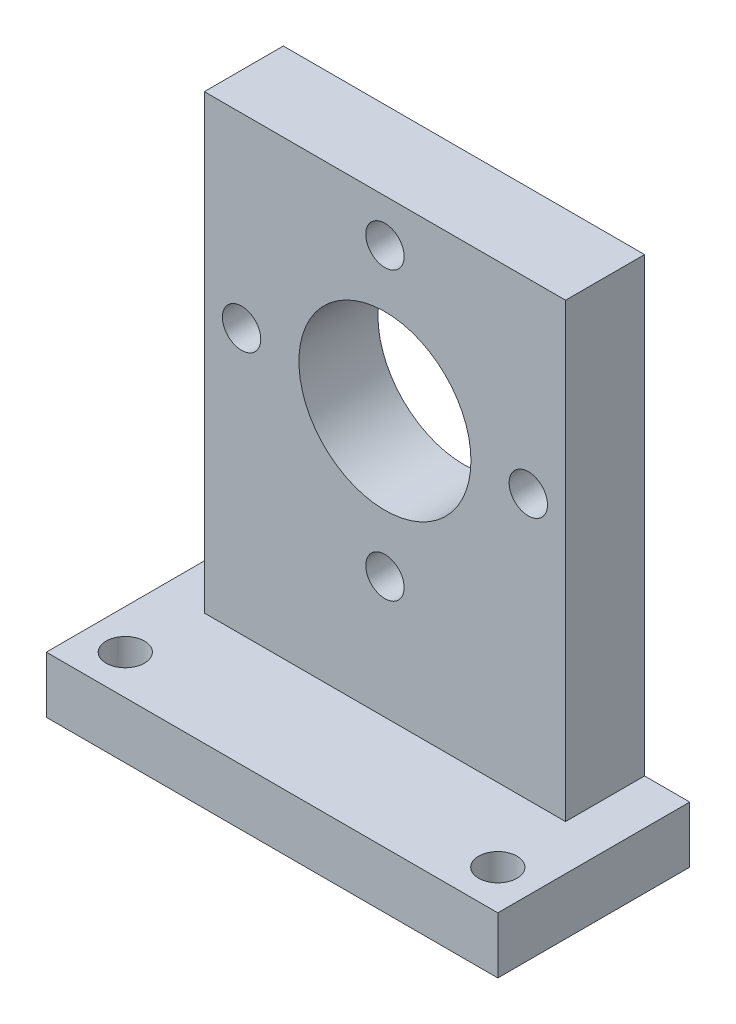
ISO-10303-21;
HEADER;
FILE_DESCRIPTION(('STEP AP214'),'2;1');
FILE_NAME('part.step','',(''),(''),'','','');
FILE_SCHEMA(('AUTOMOTIVE_DESIGN { 1 0 10303 214 1 1 1 1 }'));
ENDSEC;
DATA;
#1=APPLICATION_CONTEXT('core data for automotive mechanical design processes');
#2=APPLICATION_PROTOCOL_DEFINITION('international standard','automotive_design',2000,#1);
#3=PRODUCT_CONTEXT('',#1,'mechanical');
#4=PRODUCT('Part','Part','',(#3));
#5=PRODUCT_RELATED_PRODUCT_CATEGORY('part','',(#4));
#6=PRODUCT_DEFINITION_FORMATION('','',#4);
#7=PRODUCT_DEFINITION_CONTEXT('part definition',#1,'design');
#8=PRODUCT_DEFINITION('design','',#6,#7);
#9=PRODUCT_DEFINITION_SHAPE('','',#8);
#10=(LENGTH_UNIT() NAMED_UNIT(*) SI_UNIT(.MILLI.,.METRE.));
#11=(NAMED_UNIT(*) PLANE_ANGLE_UNIT() SI_UNIT($,.RADIAN.));
#12=(NAMED_UNIT(*) SI_UNIT($,.STERADIAN.) SOLID_ANGLE_UNIT());
#13=UNCERTAINTY_MEASURE_WITH_UNIT(LENGTH_MEASURE(1.E-05),#10,'distance_accuracy_value','');
#14=(GEOMETRIC_REPRESENTATION_CONTEXT(3) GLOBAL_UNCERTAINTY_ASSIGNED_CONTEXT((#13)) GLOBAL_UNIT_ASSIGNED_CONTEXT((#10,
#11,#12)) REPRESENTATION_CONTEXT('',''));
#15=CARTESIAN_POINT('',(0.,0.,0.));
#16=DIRECTION('',(0.,0.,1.));
#17=DIRECTION('',(1.,0.,0.));
#18=AXIS2_PLACEMENT_3D('',#15,#16,#17);
#19=CARTESIAN_POINT('',(-20.,5.,13.5));
#20=DIRECTION('',(0.,0.,-1.));
#21=DIRECTION('',(-1.,0.,0.));
#22=AXIS2_PLACEMENT_3D('',#19,#20,#21);
#23=PLANE('',#22);
#24=DIRECTION('',(1.,0.,0.));
#25=VECTOR('',#24,1.);
#26=CARTESIAN_POINT('',(-20.,0.,13.5));
#27=LINE('',#26,#25);
#28=CARTESIAN_POINT('',(-20.,0.,13.5));
#29=VERTEX_POINT('',#28);
#30=CARTESIAN_POINT('',(20.,0.,13.5));
#31=VERTEX_POINT('',#30);
#32=EDGE_CURVE('E113',#29,#31,#27,.T.);
#33=ORIENTED_EDGE('',*,*,#32,.T.);
#34=DIRECTION('',(0.,-1.,0.));
#35=VECTOR('',#34,1.);
#36=CARTESIAN_POINT('',(20.,5.,13.5));
#37=LINE('',#36,#35);
#38=CARTESIAN_POINT('',(20.,5.,13.5));
#39=VERTEX_POINT('',#38);
#40=EDGE_CURVE('E12',#39,#31,#37,.T.);
#41=ORIENTED_EDGE('',*,*,#40,.F.);
#42=DIRECTION('',(1.,0.,0.));
#43=VECTOR('',#42,1.);
#44=CARTESIAN_POINT('',(-20.,5.,13.5));
#45=LINE('',#44,#43);
#46=CARTESIAN_POINT('',(-20.,5.,13.5));
#47=VERTEX_POINT('',#46);
#48=EDGE_CURVE('E107',#47,#39,#45,.T.);
#49=ORIENTED_EDGE('',*,*,#48,.F.);
#50=DIRECTION('',(0.,-1.,0.));
#51=VECTOR('',#50,1.);
#52=CARTESIAN_POINT('',(-20.,5.,13.5));
#53=LINE('',#52,#51);
#54=EDGE_CURVE('E68',#47,#29,#53,.T.);
#55=ORIENTED_EDGE('',*,*,#54,.T.);
#56=EDGE_LOOP('',(#33,#41,#49,#55));
#57=FACE_BOUND('',#56,.T.);
#58=ADVANCED_FACE('F61',(#57),#23,.F.);
#59=CARTESIAN_POINT('',(20.,5.,-13.5));
#60=DIRECTION('',(1.,0.,0.));
#61=DIRECTION('',(0.,0.,-1.));
#62=AXIS2_PLACEMENT_3D('',#59,#60,#61);
#63=PLANE('',#62);
#64=DIRECTION('',(0.,1.,0.));
#65=VECTOR('',#64,1.);
#66=CARTESIAN_POINT('',(20.,-0.00100000000000013,-3.5));
#67=LINE('',#66,#65);
#68=CARTESIAN_POINT('',(20.,0.,-3.5));
#69=VERTEX_POINT('',#68);
#70=CARTESIAN_POINT('',(20.,5.,-3.5));
#71=VERTEX_POINT('',#70);
#72=EDGE_CURVE('E197',#69,#71,#67,.T.);
#73=ORIENTED_EDGE('',*,*,#72,.T.);
#74=DIRECTION('',(0.,0.,1.));
#75=VECTOR('',#74,1.);
#76=CARTESIAN_POINT('',(20.,5.,-13.5));
#77=LINE('',#76,#75);
#78=EDGE_CURVE('E123',#71,#39,#77,.T.);
#79=ORIENTED_EDGE('',*,*,#78,.T.);
#80=ORIENTED_EDGE('',*,*,#40,.T.);
#81=DIRECTION('',(0.,0.,1.));
#82=VECTOR('',#81,1.);
#83=CARTESIAN_POINT('',(20.,0.,-13.5));
#84=LINE('',#83,#82);
#85=EDGE_CURVE('E108',#69,#31,#84,.T.);
#86=ORIENTED_EDGE('',*,*,#85,.F.);
#87=EDGE_LOOP('',(#73,#79,#80,#86));
#88=FACE_BOUND('',#87,.T.);
#89=ADVANCED_FACE('F233',(#88),#63,.T.);
#90=CARTESIAN_POINT('',(-20.,5.,-13.5));
#91=DIRECTION('',(1.,0.,0.));
#92=DIRECTION('',(0.,0.,-1.));
#93=AXIS2_PLACEMENT_3D('',#90,#91,#92);
#94=PLANE('',#93);
#95=DIRECTION('',(0.,0.,1.));
#96=VECTOR('',#95,1.);
#97=CARTESIAN_POINT('',(-20.,5.,-13.5));
#98=LINE('',#97,#96);
#99=CARTESIAN_POINT('',(-20.,5.,-3.5));
#100=VERTEX_POINT('',#99);
#101=EDGE_CURVE('E83',#100,#47,#98,.T.);
#102=ORIENTED_EDGE('',*,*,#101,.F.);
#103=DIRECTION('',(0.,1.,0.));
#104=VECTOR('',#103,1.);
#105=CARTESIAN_POINT('',(-20.,-0.00100000000000013,-3.5));
#106=LINE('',#105,#104);
#107=CARTESIAN_POINT('',(-20.,0.,-3.5));
#108=VERTEX_POINT('',#107);
#109=EDGE_CURVE('E103',#108,#100,#106,.T.);
#110=ORIENTED_EDGE('',*,*,#109,.F.);
#111=DIRECTION('',(0.,0.,1.));
#112=VECTOR('',#111,1.);
#113=CARTESIAN_POINT('',(-20.,0.,-13.5));
#114=LINE('',#113,#112);
#115=EDGE_CURVE('E97',#108,#29,#114,.T.);
#116=ORIENTED_EDGE('',*,*,#115,.T.);
#117=ORIENTED_EDGE('',*,*,#54,.F.);
#118=EDGE_LOOP('',(#102,#110,#116,#117));
#119=FACE_BOUND('',#118,.T.);
#120=ADVANCED_FACE('F99',(#119),#94,.F.);
#121=CARTESIAN_POINT('',(0.,5.,0.));
#122=DIRECTION('',(0.,-1.,0.));
#123=DIRECTION('',(0.,0.,-1.));
#124=AXIS2_PLACEMENT_3D('',#121,#122,#123);
#125=PLANE('',#124);
#126=CARTESIAN_POINT('',(16.5,5.,10.));
#127=DIRECTION('',(0.,1.,0.));
#128=DIRECTION('',(0.,0.,-1.));
#129=AXIS2_PLACEMENT_3D('',#126,#127,#128);
#130=CIRCLE('',#129,1.7);
#131=CARTESIAN_POINT('',(16.5,5.,8.3));
#132=VERTEX_POINT('',#131);
#133=EDGE_CURVE('E184',#132,#132,#130,.T.);
#134=ORIENTED_EDGE('',*,*,#133,.F.);
#135=EDGE_LOOP('',(#134));
#136=FACE_BOUND('',#135,.T.);
#137=CARTESIAN_POINT('',(-16.5,5.,10.));
#138=DIRECTION('',(0.,1.,0.));
#139=DIRECTION('',(0.,0.,1.));
#140=AXIS2_PLACEMENT_3D('',#137,#138,#139);
#141=CIRCLE('',#140,1.7);
#142=CARTESIAN_POINT('',(-16.5,5.,11.7));
#143=VERTEX_POINT('',#142);
#144=EDGE_CURVE('E191',#143,#143,#141,.T.);
#145=ORIENTED_EDGE('',*,*,#144,.F.);
#146=EDGE_LOOP('',(#145));
#147=FACE_BOUND('',#146,.T.);
#148=ORIENTED_EDGE('',*,*,#78,.F.);
#149=DIRECTION('',(1.,0.,0.));
#150=VECTOR('',#149,1.);
#151=CARTESIAN_POINT('',(-20.,5.,-3.5));
#152=LINE('',#151,#150);
#153=CARTESIAN_POINT('',(16.,5.,-3.5));
#154=VERTEX_POINT('',#153);
#155=EDGE_CURVE('E204',#154,#71,#152,.T.);
#156=ORIENTED_EDGE('',*,*,#155,.F.);
#157=DIRECTION('',(0.,0.,1.));
#158=VECTOR('',#157,1.);
#159=CARTESIAN_POINT('',(16.,5.,0.));
#160=LINE('',#159,#158);
#161=CARTESIAN_POINT('',(16.,5.00000000000001,3.5));
#162=VERTEX_POINT('',#161);
#163=EDGE_CURVE('E127',#154,#162,#160,.T.);
#164=ORIENTED_EDGE('',*,*,#163,.T.);
#165=DIRECTION('',(1.,0.,0.));
#166=VECTOR('',#165,1.);
#167=CARTESIAN_POINT('',(0.,5.,3.5));
#168=LINE('',#167,#166);
#169=CARTESIAN_POINT('',(-16.,5.,3.5));
#170=VERTEX_POINT('',#169);
#171=EDGE_CURVE('E75',#170,#162,#168,.T.);
#172=ORIENTED_EDGE('',*,*,#171,.F.);
#173=DIRECTION('',(0.,0.,1.));
#174=VECTOR('',#173,1.);
#175=CARTESIAN_POINT('',(-16.,5.,0.));
#176=LINE('',#175,#174);
#177=CARTESIAN_POINT('',(-16.,5.,-3.5));
#178=VERTEX_POINT('',#177);
#179=EDGE_CURVE('E119',#178,#170,#176,.T.);
#180=ORIENTED_EDGE('',*,*,#179,.F.);
#181=EDGE_CURVE('E199',#100,#178,#152,.T.);
#182=ORIENTED_EDGE('',*,*,#181,.F.);
#183=ORIENTED_EDGE('',*,*,#101,.T.);
#184=ORIENTED_EDGE('',*,*,#48,.T.);
#185=EDGE_LOOP('',(#148,#156,#164,#172,#180,#182,#183,#184));
#186=FACE_BOUND('',#185,.T.);
#187=ADVANCED_FACE('F234',(#136,#147,#186),#125,.F.);
#188=CARTESIAN_POINT('',(0.,0.,0.));
#189=DIRECTION('',(0.,-1.,0.));
#190=DIRECTION('',(0.,0.,-1.));
#191=AXIS2_PLACEMENT_3D('',#188,#189,#190);
#192=PLANE('',#191);
#193=DIRECTION('',(1.,0.,0.));
#194=VECTOR('',#193,1.);
#195=CARTESIAN_POINT('',(-20.,0.,-3.5));
#196=LINE('',#195,#194);
#197=EDGE_CURVE('E188',#108,#69,#196,.T.);
#198=ORIENTED_EDGE('',*,*,#197,.T.);
#199=ORIENTED_EDGE('',*,*,#85,.T.);
#200=ORIENTED_EDGE('',*,*,#32,.F.);
#201=ORIENTED_EDGE('',*,*,#115,.F.);
#202=EDGE_LOOP('',(#198,#199,#200,#201));
#203=FACE_BOUND('',#202,.T.);
#204=CARTESIAN_POINT('',(16.5,0.,10.));
#205=DIRECTION('',(0.,-1.,0.));
#206=DIRECTION('',(0.,0.,-1.));
#207=AXIS2_PLACEMENT_3D('',#204,#205,#206);
#208=CIRCLE('',#207,1.7);
#209=CARTESIAN_POINT('',(16.5,0.,8.3));
#210=VERTEX_POINT('',#209);
#211=EDGE_CURVE('E187',#210,#210,#208,.F.);
#212=ORIENTED_EDGE('',*,*,#211,.T.);
#213=EDGE_LOOP('',(#212));
#214=FACE_BOUND('',#213,.T.);
#215=CARTESIAN_POINT('',(-16.5,0.,10.));
#216=DIRECTION('',(0.,-1.,0.));
#217=DIRECTION('',(0.,0.,-1.));
#218=AXIS2_PLACEMENT_3D('',#215,#216,#217);
#219=CIRCLE('',#218,1.7);
#220=CARTESIAN_POINT('',(-16.5,0.,8.30000000000001));
#221=VERTEX_POINT('',#220);
#222=EDGE_CURVE('E164',#221,#221,#219,.F.);
#223=ORIENTED_EDGE('',*,*,#222,.T.);
#224=EDGE_LOOP('',(#223));
#225=FACE_BOUND('',#224,.T.);
#226=ADVANCED_FACE('F114',(#203,#214,#225),#192,.T.);
#227=CARTESIAN_POINT('',(0.,45.,-3.5));
#228=DIRECTION('',(0.,0.,-1.));
#229=DIRECTION('',(-1.,0.,0.));
#230=AXIS2_PLACEMENT_3D('',#227,#228,#229);
#231=PLANE('',#230);
#232=CARTESIAN_POINT('',(12.7000000000002,2.5,-3.5));
#233=DIRECTION('',(0.,0.,-1.));
#234=DIRECTION('',(-1.,0.,0.));
#235=AXIS2_PLACEMENT_3D('',#232,#233,#234);
#236=CIRCLE('',#235,1.7);
#237=CARTESIAN_POINT('',(11.0000000000002,2.5,-3.5));
#238=VERTEX_POINT('',#237);
#239=EDGE_CURVE('E211',#238,#238,#236,.T.);
#240=ORIENTED_EDGE('',*,*,#239,.F.);
#241=EDGE_LOOP('',(#240));
#242=FACE_BOUND('',#241,.T.);
#243=CARTESIAN_POINT('',(-12.7000000000002,2.5,-3.5));
#244=DIRECTION('',(0.,0.,-1.));
#245=DIRECTION('',(1.,0.,0.));
#246=AXIS2_PLACEMENT_3D('',#243,#244,#245);
#247=CIRCLE('',#246,1.7);
#248=CARTESIAN_POINT('',(-11.0000000000002,2.5,-3.5));
#249=VERTEX_POINT('',#248);
#250=EDGE_CURVE('E208',#249,#249,#247,.T.);
#251=ORIENTED_EDGE('',*,*,#250,.F.);
#252=EDGE_LOOP('',(#251));
#253=FACE_BOUND('',#252,.T.);
#254=CARTESIAN_POINT('',(0.,41.2,-3.5));
#255=DIRECTION('',(0.,0.,-1.));
#256=DIRECTION('',(-1.,0.,0.));
#257=AXIS2_PLACEMENT_3D('',#254,#255,#256);
#258=CIRCLE('',#257,1.7);
#259=CARTESIAN_POINT('',(-1.7,41.2,-3.5));
#260=VERTEX_POINT('',#259);
#261=EDGE_CURVE('E179',#260,#260,#258,.F.);
#262=ORIENTED_EDGE('',*,*,#261,.T.);
#263=EDGE_LOOP('',(#262));
#264=FACE_BOUND('',#263,.T.);
#265=CARTESIAN_POINT('',(12.7000000000002,28.5000000000001,-3.5));
#266=DIRECTION('',(0.,0.,-1.));
#267=DIRECTION('',(-1.,0.,0.));
#268=AXIS2_PLACEMENT_3D('',#265,#266,#267);
#269=CIRCLE('',#268,1.7);
#270=CARTESIAN_POINT('',(11.0000000000002,28.5000000000001,-3.5));
#271=VERTEX_POINT('',#270);
#272=EDGE_CURVE('E176',#271,#271,#269,.F.);
#273=ORIENTED_EDGE('',*,*,#272,.T.);
#274=EDGE_LOOP('',(#273));
#275=FACE_BOUND('',#274,.T.);
#276=CARTESIAN_POINT('',(2.66516243803523E-13,15.8,-3.5));
#277=DIRECTION('',(0.,0.,-1.));
#278=DIRECTION('',(-1.,0.,0.));
#279=AXIS2_PLACEMENT_3D('',#276,#277,#278);
#280=CIRCLE('',#279,1.7);
#281=CARTESIAN_POINT('',(-1.69999999999973,15.8,-3.5));
#282=VERTEX_POINT('',#281);
#283=EDGE_CURVE('E170',#282,#282,#280,.F.);
#284=ORIENTED_EDGE('',*,*,#283,.T.);
#285=EDGE_LOOP('',(#284));
#286=FACE_BOUND('',#285,.T.);
#287=CARTESIAN_POINT('',(-12.6999999999998,28.5,-3.5));
#288=DIRECTION('',(0.,0.,-1.));
#289=DIRECTION('',(-1.,0.,0.));
#290=AXIS2_PLACEMENT_3D('',#287,#288,#289);
#291=CIRCLE('',#290,1.7);
#292=CARTESIAN_POINT('',(-14.3999999999998,28.5,-3.5));
#293=VERTEX_POINT('',#292);
#294=EDGE_CURVE('E163',#293,#293,#291,.F.);
#295=ORIENTED_EDGE('',*,*,#294,.T.);
#296=EDGE_LOOP('',(#295));
#297=FACE_BOUND('',#296,.T.);
#298=CARTESIAN_POINT('',(0.,28.5,-3.5));
#299=DIRECTION('',(0.,0.,-1.));
#300=DIRECTION('',(-1.,0.,0.));
#301=AXIS2_PLACEMENT_3D('',#298,#299,#300);
#302=CIRCLE('',#301,7.62);
#303=CARTESIAN_POINT('',(-7.62,28.5,-3.5));
#304=VERTEX_POINT('',#303);
#305=EDGE_CURVE('E154',#304,#304,#302,.F.);
#306=ORIENTED_EDGE('',*,*,#305,.T.);
#307=EDGE_LOOP('',(#306));
#308=FACE_BOUND('',#307,.T.);
#309=DIRECTION('',(0.,-1.,0.));
#310=VECTOR('',#309,1.);
#311=CARTESIAN_POINT('',(16.,45.,-3.5));
#312=LINE('',#311,#310);
#313=CARTESIAN_POINT('',(16.,45.,-3.5));
#314=VERTEX_POINT('',#313);
#315=EDGE_CURVE('E129',#314,#154,#312,.T.);
#316=ORIENTED_EDGE('',*,*,#315,.T.);
#317=ORIENTED_EDGE('',*,*,#155,.T.);
#318=ORIENTED_EDGE('',*,*,#72,.F.);
#319=ORIENTED_EDGE('',*,*,#197,.F.);
#320=ORIENTED_EDGE('',*,*,#109,.T.);
#321=ORIENTED_EDGE('',*,*,#181,.T.);
#322=DIRECTION('',(0.,-1.,0.));
#323=VECTOR('',#322,1.);
#324=CARTESIAN_POINT('',(-16.,45.,-3.5));
#325=LINE('',#324,#323);
#326=CARTESIAN_POINT('',(-16.,45.,-3.5));
#327=VERTEX_POINT('',#326);
#328=EDGE_CURVE('E132',#327,#178,#325,.T.);
#329=ORIENTED_EDGE('',*,*,#328,.F.);
#330=DIRECTION('',(1.,0.,0.));
#331=VECTOR('',#330,1.);
#332=CARTESIAN_POINT('',(0.,45.,-3.5));
#333=LINE('',#332,#331);
#334=EDGE_CURVE('E147',#327,#314,#333,.T.);
#335=ORIENTED_EDGE('',*,*,#334,.T.);
#336=EDGE_LOOP('',(#316,#317,#318,#319,#320,#321,#329,#335));
#337=FACE_BOUND('',#336,.T.);
#338=ADVANCED_FACE('F223',(#242,#253,#264,#275,#286,#297,#308,#337),#231,.T.);
#339=CARTESIAN_POINT('',(0.,45.,3.5));
#340=DIRECTION('',(0.,0.,-1.));
#341=DIRECTION('',(-1.,0.,0.));
#342=AXIS2_PLACEMENT_3D('',#339,#340,#341);
#343=PLANE('',#342);
#344=CARTESIAN_POINT('',(0.,41.2,3.5));
#345=DIRECTION('',(0.,0.,1.));
#346=DIRECTION('',(1.,0.,0.));
#347=AXIS2_PLACEMENT_3D('',#344,#345,#346);
#348=CIRCLE('',#347,1.7);
#349=CARTESIAN_POINT('',(1.7,41.2,3.5));
#350=VERTEX_POINT('',#349);
#351=EDGE_CURVE('E157',#350,#350,#348,.T.);
#352=ORIENTED_EDGE('',*,*,#351,.F.);
#353=EDGE_LOOP('',(#352));
#354=FACE_BOUND('',#353,.T.);
#355=CARTESIAN_POINT('',(12.7000000000002,28.5000000000001,3.5));
#356=DIRECTION('',(0.,0.,1.));
#357=DIRECTION('',(1.,0.,0.));
#358=AXIS2_PLACEMENT_3D('',#355,#356,#357);
#359=CIRCLE('',#358,1.7);
#360=CARTESIAN_POINT('',(14.4000000000002,28.5000000000001,3.5));
#361=VERTEX_POINT('',#360);
#362=EDGE_CURVE('E173',#361,#361,#359,.T.);
#363=ORIENTED_EDGE('',*,*,#362,.F.);
#364=EDGE_LOOP('',(#363));
#365=FACE_BOUND('',#364,.T.);
#366=CARTESIAN_POINT('',(2.66516243803523E-13,15.8,3.5));
#367=DIRECTION('',(0.,0.,1.));
#368=DIRECTION('',(1.,0.,0.));
#369=AXIS2_PLACEMENT_3D('',#366,#367,#368);
#370=CIRCLE('',#369,1.7);
#371=CARTESIAN_POINT('',(1.70000000000027,15.8,3.5));
#372=VERTEX_POINT('',#371);
#373=EDGE_CURVE('E167',#372,#372,#370,.T.);
#374=ORIENTED_EDGE('',*,*,#373,.F.);
#375=EDGE_LOOP('',(#374));
#376=FACE_BOUND('',#375,.T.);
#377=CARTESIAN_POINT('',(-12.6999999999998,28.5,3.5));
#378=DIRECTION('',(0.,0.,1.));
#379=DIRECTION('',(1.,0.,0.));
#380=AXIS2_PLACEMENT_3D('',#377,#378,#379);
#381=CIRCLE('',#380,1.7);
#382=CARTESIAN_POINT('',(-10.9999999999998,28.5,3.5));
#383=VERTEX_POINT('',#382);
#384=EDGE_CURVE('E160',#383,#383,#381,.T.);
#385=ORIENTED_EDGE('',*,*,#384,.F.);
#386=EDGE_LOOP('',(#385));
#387=FACE_BOUND('',#386,.T.);
#388=CARTESIAN_POINT('',(0.,28.5,3.5));
#389=DIRECTION('',(0.,0.,1.));
#390=DIRECTION('',(1.,0.,0.));
#391=AXIS2_PLACEMENT_3D('',#388,#389,#390);
#392=CIRCLE('',#391,7.62);
#393=CARTESIAN_POINT('',(7.62,28.5,3.5));
#394=VERTEX_POINT('',#393);
#395=EDGE_CURVE('E153',#394,#394,#392,.T.);
#396=ORIENTED_EDGE('',*,*,#395,.F.);
#397=EDGE_LOOP('',(#396));
#398=FACE_BOUND('',#397,.T.);
#399=DIRECTION('',(0.,-1.,0.));
#400=VECTOR('',#399,1.);
#401=CARTESIAN_POINT('',(-16.,45.,3.5));
#402=LINE('',#401,#400);
#403=CARTESIAN_POINT('',(-16.,45.,3.5));
#404=VERTEX_POINT('',#403);
#405=EDGE_CURVE('E135',#404,#170,#402,.T.);
#406=ORIENTED_EDGE('',*,*,#405,.T.);
#407=ORIENTED_EDGE('',*,*,#171,.T.);
#408=DIRECTION('',(0.,-1.,0.));
#409=VECTOR('',#408,1.);
#410=CARTESIAN_POINT('',(16.,45.,3.5));
#411=LINE('',#410,#409);
#412=CARTESIAN_POINT('',(16.,45.,3.5));
#413=VERTEX_POINT('',#412);
#414=EDGE_CURVE('E138',#413,#162,#411,.T.);
#415=ORIENTED_EDGE('',*,*,#414,.F.);
#416=DIRECTION('',(1.,0.,0.));
#417=VECTOR('',#416,1.);
#418=CARTESIAN_POINT('',(0.,45.,3.5));
#419=LINE('',#418,#417);
#420=EDGE_CURVE('E141',#404,#413,#419,.T.);
#421=ORIENTED_EDGE('',*,*,#420,.F.);
#422=EDGE_LOOP('',(#406,#407,#415,#421));
#423=FACE_BOUND('',#422,.T.);
#424=ADVANCED_FACE('F284',(#354,#365,#376,#387,#398,#423),#343,.F.);
#425=CARTESIAN_POINT('',(16.,45.,0.));
#426=DIRECTION('',(1.,0.,0.));
#427=DIRECTION('',(0.,0.,-1.));
#428=AXIS2_PLACEMENT_3D('',#425,#426,#427);
#429=PLANE('',#428);
#430=ORIENTED_EDGE('',*,*,#163,.F.);
#431=ORIENTED_EDGE('',*,*,#315,.F.);
#432=DIRECTION('',(0.,0.,1.));
#433=VECTOR('',#432,1.);
#434=CARTESIAN_POINT('',(16.,45.,0.));
#435=LINE('',#434,#433);
#436=EDGE_CURVE('E150',#314,#413,#435,.T.);
#437=ORIENTED_EDGE('',*,*,#436,.T.);
#438=ORIENTED_EDGE('',*,*,#414,.T.);
#439=EDGE_LOOP('',(#430,#431,#437,#438));
#440=FACE_BOUND('',#439,.T.);
#441=ADVANCED_FACE('F278',(#440),#429,.T.);
#442=CARTESIAN_POINT('',(-16.,45.,0.));
#443=DIRECTION('',(1.,0.,0.));
#444=DIRECTION('',(0.,0.,-1.));
#445=AXIS2_PLACEMENT_3D('',#442,#443,#444);
#446=PLANE('',#445);
#447=ORIENTED_EDGE('',*,*,#328,.T.);
#448=ORIENTED_EDGE('',*,*,#179,.T.);
#449=ORIENTED_EDGE('',*,*,#405,.F.);
#450=DIRECTION('',(0.,0.,1.));
#451=VECTOR('',#450,1.);
#452=CARTESIAN_POINT('',(-16.,45.,0.));
#453=LINE('',#452,#451);
#454=EDGE_CURVE('E144',#327,#404,#453,.T.);
#455=ORIENTED_EDGE('',*,*,#454,.F.);
#456=EDGE_LOOP('',(#447,#448,#449,#455));
#457=FACE_BOUND('',#456,.T.);
#458=ADVANCED_FACE('F283',(#457),#446,.F.);
#459=CARTESIAN_POINT('',(0.,45.,0.));
#460=DIRECTION('',(0.,1.,0.));
#461=DIRECTION('',(0.,0.,1.));
#462=AXIS2_PLACEMENT_3D('',#459,#460,#461);
#463=PLANE('',#462);
#464=ORIENTED_EDGE('',*,*,#436,.F.);
#465=ORIENTED_EDGE('',*,*,#334,.F.);
#466=ORIENTED_EDGE('',*,*,#454,.T.);
#467=ORIENTED_EDGE('',*,*,#420,.T.);
#468=EDGE_LOOP('',(#464,#465,#466,#467));
#469=FACE_BOUND('',#468,.T.);
#470=ADVANCED_FACE('F296',(#469),#463,.T.);
#471=CARTESIAN_POINT('',(0.,28.5,-13.501));
#472=DIRECTION('',(0.,0.,1.));
#473=DIRECTION('',(1.,0.,0.));
#474=AXIS2_PLACEMENT_3D('',#471,#472,#473);
#475=CYLINDRICAL_SURFACE('',#474,7.62);
#476=ORIENTED_EDGE('',*,*,#305,.F.);
#477=EDGE_LOOP('',(#476));
#478=FACE_BOUND('',#477,.T.);
#479=ORIENTED_EDGE('',*,*,#395,.T.);
#480=EDGE_LOOP('',(#479));
#481=FACE_BOUND('',#480,.T.);
#482=ADVANCED_FACE('F414',(#478,#481),#475,.F.);
#483=CARTESIAN_POINT('',(-12.6999999999998,28.5,-13.501));
#484=DIRECTION('',(0.,0.,1.));
#485=DIRECTION('',(1.,0.,0.));
#486=AXIS2_PLACEMENT_3D('',#483,#484,#485);
#487=CYLINDRICAL_SURFACE('',#486,1.7);
#488=ORIENTED_EDGE('',*,*,#294,.F.);
#489=EDGE_LOOP('',(#488));
#490=FACE_BOUND('',#489,.T.);
#491=ORIENTED_EDGE('',*,*,#384,.T.);
#492=EDGE_LOOP('',(#491));
#493=FACE_BOUND('',#492,.T.);
#494=ADVANCED_FACE('F404',(#490,#493),#487,.F.);
#495=CARTESIAN_POINT('',(2.66516243803523E-13,15.8,-13.501));
#496=DIRECTION('',(0.,0.,1.));
#497=DIRECTION('',(1.,0.,0.));
#498=AXIS2_PLACEMENT_3D('',#495,#496,#497);
#499=CYLINDRICAL_SURFACE('',#498,1.7);
#500=ORIENTED_EDGE('',*,*,#283,.F.);
#501=EDGE_LOOP('',(#500));
#502=FACE_BOUND('',#501,.T.);
#503=ORIENTED_EDGE('',*,*,#373,.T.);
#504=EDGE_LOOP('',(#503));
#505=FACE_BOUND('',#504,.T.);
#506=ADVANCED_FACE('F394',(#502,#505),#499,.F.);
#507=CARTESIAN_POINT('',(12.7000000000002,28.5000000000001,-13.501));
#508=DIRECTION('',(0.,0.,1.));
#509=DIRECTION('',(1.,0.,0.));
#510=AXIS2_PLACEMENT_3D('',#507,#508,#509);
#511=CYLINDRICAL_SURFACE('',#510,1.7);
#512=ORIENTED_EDGE('',*,*,#272,.F.);
#513=EDGE_LOOP('',(#512));
#514=FACE_BOUND('',#513,.T.);
#515=ORIENTED_EDGE('',*,*,#362,.T.);
#516=EDGE_LOOP('',(#515));
#517=FACE_BOUND('',#516,.T.);
#518=ADVANCED_FACE('F384',(#514,#517),#511,.F.);
#519=CARTESIAN_POINT('',(0.,41.2,-13.501));
#520=DIRECTION('',(0.,0.,1.));
#521=DIRECTION('',(1.,0.,0.));
#522=AXIS2_PLACEMENT_3D('',#519,#520,#521);
#523=CYLINDRICAL_SURFACE('',#522,1.7);
#524=ORIENTED_EDGE('',*,*,#261,.F.);
#525=EDGE_LOOP('',(#524));
#526=FACE_BOUND('',#525,.T.);
#527=ORIENTED_EDGE('',*,*,#351,.T.);
#528=EDGE_LOOP('',(#527));
#529=FACE_BOUND('',#528,.T.);
#530=ADVANCED_FACE('F374',(#526,#529),#523,.F.);
#531=CARTESIAN_POINT('',(-16.5,-0.00100000000000013,10.));
#532=DIRECTION('',(0.,1.,0.));
#533=DIRECTION('',(0.,0.,1.));
#534=AXIS2_PLACEMENT_3D('',#531,#532,#533);
#535=CYLINDRICAL_SURFACE('',#534,1.7);
#536=ORIENTED_EDGE('',*,*,#222,.F.);
#537=EDGE_LOOP('',(#536));
#538=FACE_BOUND('',#537,.T.);
#539=ORIENTED_EDGE('',*,*,#144,.T.);
#540=EDGE_LOOP('',(#539));
#541=FACE_BOUND('',#540,.T.);
#542=ADVANCED_FACE('F365',(#538,#541),#535,.F.);
#543=CARTESIAN_POINT('',(16.5,-0.00100000000000013,10.));
#544=DIRECTION('',(0.,1.,0.));
#545=DIRECTION('',(0.,0.,1.));
#546=AXIS2_PLACEMENT_3D('',#543,#544,#545);
#547=CYLINDRICAL_SURFACE('',#546,1.7);
#548=ORIENTED_EDGE('',*,*,#211,.F.);
#549=EDGE_LOOP('',(#548));
#550=FACE_BOUND('',#549,.T.);
#551=ORIENTED_EDGE('',*,*,#133,.T.);
#552=EDGE_LOOP('',(#551));
#553=FACE_BOUND('',#552,.T.);
#554=ADVANCED_FACE('F320',(#550,#553),#547,.F.);
#555=CARTESIAN_POINT('',(-12.7000000000002,2.5,2.85));
#556=DIRECTION('',(0.,0.,-1.));
#557=DIRECTION('',(-1.,0.,0.));
#558=AXIS2_PLACEMENT_3D('',#555,#556,#557);
#559=CYLINDRICAL_SURFACE('',#558,1.7);
#560=CARTESIAN_POINT('',(-12.7000000000002,2.5,2.85));
#561=DIRECTION('',(0.,0.,-1.));
#562=DIRECTION('',(1.,0.,0.));
#563=AXIS2_PLACEMENT_3D('',#560,#561,#562);
#564=CIRCLE('',#563,1.7);
#565=CARTESIAN_POINT('',(-11.0000000000002,2.5,2.85));
#566=VERTEX_POINT('',#565);
#567=EDGE_CURVE('E205',#566,#566,#564,.T.);
#568=ORIENTED_EDGE('',*,*,#567,.F.);
#569=EDGE_LOOP('',(#568));
#570=FACE_BOUND('',#569,.T.);
#571=ORIENTED_EDGE('',*,*,#250,.T.);
#572=EDGE_LOOP('',(#571));
#573=FACE_BOUND('',#572,.T.);
#574=ADVANCED_FACE('F315',(#570,#573),#559,.F.);
#575=CARTESIAN_POINT('',(-12.7000000000002,2.5,2.85));
#576=DIRECTION('',(0.,0.,1.));
#577=DIRECTION('',(1.,0.,0.));
#578=AXIS2_PLACEMENT_3D('',#575,#576,#577);
#579=PLANE('',#578);
#580=ORIENTED_EDGE('',*,*,#567,.T.);
#581=EDGE_LOOP('',(#580));
#582=FACE_BOUND('',#581,.T.);
#583=ADVANCED_FACE('F319',(#582),#579,.F.);
#584=CARTESIAN_POINT('',(12.7000000000002,2.5,2.85));
#585=DIRECTION('',(0.,0.,-1.));
#586=DIRECTION('',(-1.,0.,0.));
#587=AXIS2_PLACEMENT_3D('',#584,#585,#586);
#588=CYLINDRICAL_SURFACE('',#587,1.7);
#589=CARTESIAN_POINT('',(12.7000000000002,2.5,2.85));
#590=DIRECTION('',(0.,0.,-1.));
#591=DIRECTION('',(-1.,0.,0.));
#592=AXIS2_PLACEMENT_3D('',#589,#590,#591);
#593=CIRCLE('',#592,1.7);
#594=CARTESIAN_POINT('',(11.0000000000002,2.5,2.85));
#595=VERTEX_POINT('',#594);
#596=EDGE_CURVE('E214',#595,#595,#593,.T.);
#597=ORIENTED_EDGE('',*,*,#596,.F.);
#598=EDGE_LOOP('',(#597));
#599=FACE_BOUND('',#598,.T.);
#600=ORIENTED_EDGE('',*,*,#239,.T.);
#601=EDGE_LOOP('',(#600));
#602=FACE_BOUND('',#601,.T.);
#603=ADVANCED_FACE('F332',(#599,#602),#588,.F.);
#604=CARTESIAN_POINT('',(12.7000000000002,2.5,2.85));
#605=DIRECTION('',(0.,0.,-1.));
#606=DIRECTION('',(-1.,0.,0.));
#607=AXIS2_PLACEMENT_3D('',#604,#605,#606);
#608=PLANE('',#607);
#609=ORIENTED_EDGE('',*,*,#596,.T.);
#610=EDGE_LOOP('',(#609));
#611=FACE_BOUND('',#610,.T.);
#612=ADVANCED_FACE('F343',(#611),#608,.T.);
#613=CLOSED_SHELL('',(#58,#89,#120,#187,#226,#338,#424,#441,#458,#470,#482,#494,#506,#518,#530,
#542,#554,#574,#583,#603,#612));
#614=MANIFOLD_SOLID_BREP('B2',#613);
#615=ADVANCED_BREP_SHAPE_REPRESENTATION('',(#18,#614),#14);
#616=SHAPE_DEFINITION_REPRESENTATION(#9,#615);
ENDSEC;
END-ISO-10303-21;
